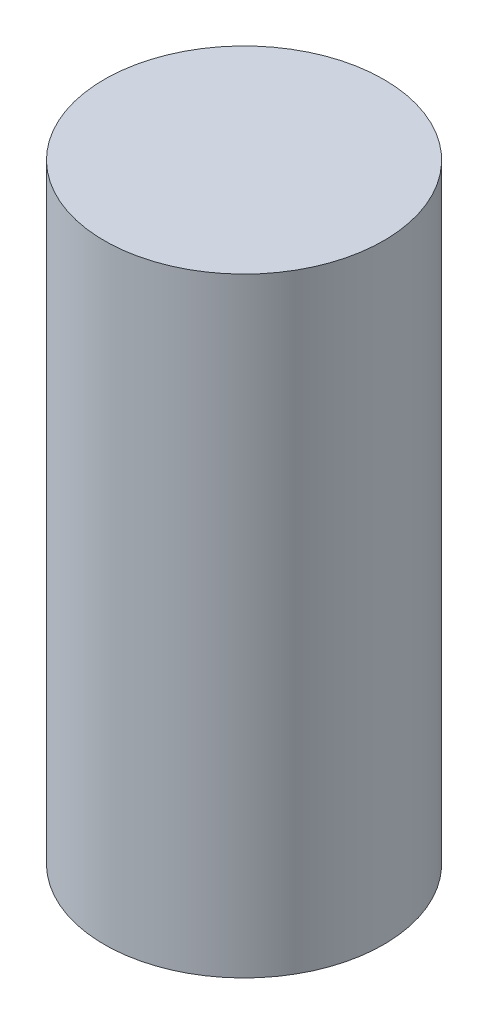
ISO-10303-21;
HEADER;
FILE_DESCRIPTION(('STEP AP214'),'2;1');
FILE_NAME('part.step','',(''),(''),'','','');
FILE_SCHEMA(('AUTOMOTIVE_DESIGN { 1 0 10303 214 1 1 1 1 }'));
ENDSEC;
DATA;
#1=APPLICATION_CONTEXT('core data for automotive mechanical design processes');
#2=APPLICATION_PROTOCOL_DEFINITION('international standard','automotive_design',2000,#1);
#3=PRODUCT_CONTEXT('',#1,'mechanical');
#4=PRODUCT('Part','Part','',(#3));
#5=PRODUCT_RELATED_PRODUCT_CATEGORY('part','',(#4));
#6=PRODUCT_DEFINITION_FORMATION('','',#4);
#7=PRODUCT_DEFINITION_CONTEXT('part definition',#1,'design');
#8=PRODUCT_DEFINITION('design','',#6,#7);
#9=PRODUCT_DEFINITION_SHAPE('','',#8);
#10=(LENGTH_UNIT() NAMED_UNIT(*) SI_UNIT(.MILLI.,.METRE.));
#11=(NAMED_UNIT(*) PLANE_ANGLE_UNIT() SI_UNIT($,.RADIAN.));
#12=(NAMED_UNIT(*) SI_UNIT($,.STERADIAN.) SOLID_ANGLE_UNIT());
#13=UNCERTAINTY_MEASURE_WITH_UNIT(LENGTH_MEASURE(1.E-05),#10,'distance_accuracy_value','');
#14=(GEOMETRIC_REPRESENTATION_CONTEXT(3) GLOBAL_UNCERTAINTY_ASSIGNED_CONTEXT((#13)) GLOBAL_UNIT_ASSIGNED_CONTEXT((#10,
#11,#12)) REPRESENTATION_CONTEXT('',''));
#15=CARTESIAN_POINT('',(0.,0.,0.));
#16=DIRECTION('',(0.,0.,1.));
#17=DIRECTION('',(1.,0.,0.));
#18=AXIS2_PLACEMENT_3D('',#15,#16,#17);
#19=CARTESIAN_POINT('',(0.,6.5,0.));
#20=DIRECTION('',(0.,-1.,0.));
#21=DIRECTION('',(0.,0.,-1.));
#22=AXIS2_PLACEMENT_3D('',#19,#20,#21);
#23=CYLINDRICAL_SURFACE('',#22,1.49);
#24=CARTESIAN_POINT('',(0.,6.5,0.));
#25=DIRECTION('',(0.,1.,0.));
#26=DIRECTION('',(0.,0.,1.));
#27=AXIS2_PLACEMENT_3D('',#24,#25,#26);
#28=CIRCLE('',#27,1.49);
#29=CARTESIAN_POINT('',(0.,6.5,-1.49));
#30=VERTEX_POINT('',#29);
#31=EDGE_CURVE('E10',#30,#30,#28,.T.);
#32=CARTESIAN_POINT('',(0.,0.,0.));
#33=DIRECTION('',(0.,1.,0.));
#34=DIRECTION('',(0.,0.,1.));
#35=AXIS2_PLACEMENT_3D('',#32,#33,#34);
#36=CIRCLE('',#35,1.49);
#37=CARTESIAN_POINT('',(0.,0.,-1.49));
#38=VERTEX_POINT('',#37);
#39=EDGE_CURVE('E44',#38,#38,#36,.T.);
#40=CARTESIAN_POINT('',(0.,6.5,-1.49));
#41=CARTESIAN_POINT('',(0.,6.43229166666667,-1.49));
#42=CARTESIAN_POINT('',(0.,6.36458333333333,-1.49));
#43=CARTESIAN_POINT('',(0.,6.22916666666667,-1.49));
#44=CARTESIAN_POINT('',(0.,6.16145833333333,-1.49));
#45=CARTESIAN_POINT('',(0.,6.02604166666667,-1.49));
#46=CARTESIAN_POINT('',(0.,5.95833333333333,-1.49));
#47=CARTESIAN_POINT('',(0.,5.82291666666667,-1.49));
#48=CARTESIAN_POINT('',(0.,5.75520833333333,-1.49));
#49=CARTESIAN_POINT('',(0.,5.61979166666667,-1.49));
#50=CARTESIAN_POINT('',(0.,5.55208333333333,-1.49));
#51=CARTESIAN_POINT('',(0.,5.41666666666667,-1.49));
#52=CARTESIAN_POINT('',(0.,5.34895833333333,-1.49));
#53=CARTESIAN_POINT('',(0.,5.21354166666667,-1.49));
#54=CARTESIAN_POINT('',(0.,5.14583333333333,-1.49));
#55=CARTESIAN_POINT('',(0.,5.01041666666667,-1.49));
#56=CARTESIAN_POINT('',(0.,4.94270833333333,-1.49));
#57=CARTESIAN_POINT('',(0.,4.80729166666667,-1.49));
#58=CARTESIAN_POINT('',(0.,4.73958333333333,-1.49));
#59=CARTESIAN_POINT('',(0.,4.60416666666667,-1.49));
#60=CARTESIAN_POINT('',(0.,4.53645833333333,-1.49));
#61=CARTESIAN_POINT('',(0.,4.40104166666667,-1.49));
#62=CARTESIAN_POINT('',(0.,4.33333333333333,-1.49));
#63=CARTESIAN_POINT('',(0.,4.19791666666667,-1.49));
#64=CARTESIAN_POINT('',(0.,4.13020833333333,-1.49));
#65=CARTESIAN_POINT('',(0.,3.99479166666667,-1.49));
#66=CARTESIAN_POINT('',(0.,3.92708333333333,-1.49));
#67=CARTESIAN_POINT('',(0.,3.79166666666667,-1.49));
#68=CARTESIAN_POINT('',(0.,3.72395833333333,-1.49));
#69=CARTESIAN_POINT('',(0.,3.58854166666667,-1.49));
#70=CARTESIAN_POINT('',(0.,3.52083333333333,-1.49));
#71=CARTESIAN_POINT('',(0.,3.38541666666667,-1.49));
#72=CARTESIAN_POINT('',(0.,3.31770833333333,-1.49));
#73=CARTESIAN_POINT('',(0.,3.18229166666667,-1.49));
#74=CARTESIAN_POINT('',(0.,3.11458333333333,-1.49));
#75=CARTESIAN_POINT('',(0.,2.97916666666667,-1.49));
#76=CARTESIAN_POINT('',(0.,2.91145833333333,-1.49));
#77=CARTESIAN_POINT('',(0.,2.77604166666667,-1.49));
#78=CARTESIAN_POINT('',(0.,2.70833333333333,-1.49));
#79=CARTESIAN_POINT('',(0.,2.57291666666667,-1.49));
#80=CARTESIAN_POINT('',(0.,2.50520833333333,-1.49));
#81=CARTESIAN_POINT('',(0.,2.36979166666667,-1.49));
#82=CARTESIAN_POINT('',(0.,2.30208333333333,-1.49));
#83=CARTESIAN_POINT('',(0.,2.16666666666667,-1.49));
#84=CARTESIAN_POINT('',(0.,2.09895833333333,-1.49));
#85=CARTESIAN_POINT('',(0.,1.96354166666667,-1.49));
#86=CARTESIAN_POINT('',(0.,1.89583333333333,-1.49));
#87=CARTESIAN_POINT('',(0.,1.76041666666667,-1.49));
#88=CARTESIAN_POINT('',(0.,1.69270833333333,-1.49));
#89=CARTESIAN_POINT('',(0.,1.55729166666667,-1.49));
#90=CARTESIAN_POINT('',(0.,1.48958333333333,-1.49));
#91=CARTESIAN_POINT('',(0.,1.35416666666667,-1.49));
#92=CARTESIAN_POINT('',(0.,1.28645833333333,-1.49));
#93=CARTESIAN_POINT('',(0.,1.15104166666667,-1.49));
#94=CARTESIAN_POINT('',(0.,1.08333333333333,-1.49));
#95=CARTESIAN_POINT('',(0.,0.947916666666667,-1.49));
#96=CARTESIAN_POINT('',(0.,0.880208333333333,-1.49));
#97=CARTESIAN_POINT('',(0.,0.744791666666667,-1.49));
#98=CARTESIAN_POINT('',(0.,0.677083333333333,-1.49));
#99=CARTESIAN_POINT('',(0.,0.541666666666667,-1.49));
#100=CARTESIAN_POINT('',(0.,0.473958333333333,-1.49));
#101=CARTESIAN_POINT('',(0.,0.338541666666667,-1.49));
#102=CARTESIAN_POINT('',(0.,0.270833333333334,-1.49));
#103=CARTESIAN_POINT('',(0.,0.135416666666667,-1.49));
#104=CARTESIAN_POINT('',(0.,0.0677083333333334,-1.49));
#105=CARTESIAN_POINT('',(0.,0.,-1.49));
#106=B_SPLINE_CURVE_WITH_KNOTS('',3,(#40,#41,#42,#43,#44,#45,#46,#47,#48,#49,#50,#51,#52,#53,
#54,#55,#56,#57,#58,#59,#60,#61,#62,#63,#64,#65,#66,#67,#68,#69,#70,#71,#72,#73,#74,#75,#76,#77,
#78,#79,#80,#81,#82,#83,#84,#85,#86,#87,#88,#89,#90,#91,#92,#93,#94,#95,#96,#97,#98,#99,#100,
#101,#102,#103,#104,#105),.UNSPECIFIED.,.F.,.F.,(4,2,2,2,2,2,2,2,2,2,2,2,2,2,2,2,2,2,2,2,2,2,2,
2,2,2,2,2,2,2,2,2,4),(0.,0.203124999999999,0.40625,0.609375,0.812499999999999,1.015625,1.21875,
1.421875,1.625,1.828125,2.03125,2.234375,2.4375,2.640625,2.84375,3.046875,3.25,3.453125,3.65625,
3.859375,4.0625,4.265625,4.46875,4.671875,4.875,5.078125,5.28125,5.484375,5.6875,5.890625,
6.09375,6.296875,6.5),.UNSPECIFIED.);
#107=EDGE_CURVE('BSEAM41',#30,#38,#106,.T.);
#108=ORIENTED_EDGE('',*,*,#31,.F.);
#109=ORIENTED_EDGE('',*,*,#39,.T.);
#110=ORIENTED_EDGE('',*,*,#107,.T.);
#111=ORIENTED_EDGE('',*,*,#107,.F.);
#112=EDGE_LOOP('',(#108,#110,#109,#111));
#113=FACE_BOUND('',#112,.T.);
#114=ADVANCED_FACE('F41',(#113),#23,.T.);
#115=CARTESIAN_POINT('',(0.,6.5,0.));
#116=DIRECTION('',(0.,1.,0.));
#117=DIRECTION('',(0.,0.,1.));
#118=AXIS2_PLACEMENT_3D('',#115,#116,#117);
#119=PLANE('',#118);
#120=ORIENTED_EDGE('',*,*,#31,.T.);
#121=EDGE_LOOP('',(#120));
#122=FACE_BOUND('',#121,.T.);
#123=ADVANCED_FACE('F58',(#122),#119,.T.);
#124=CARTESIAN_POINT('',(0.,0.,0.));
#125=DIRECTION('',(0.,1.,0.));
#126=DIRECTION('',(0.,0.,1.));
#127=AXIS2_PLACEMENT_3D('',#124,#125,#126);
#128=PLANE('',#127);
#129=ORIENTED_EDGE('',*,*,#39,.F.);
#130=EDGE_LOOP('',(#129));
#131=FACE_BOUND('',#130,.T.);
#132=ADVANCED_FACE('F56',(#131),#128,.F.);
#133=CLOSED_SHELL('',(#114,#123,#132));
#134=MANIFOLD_SOLID_BREP('B2',#133);
#135=ADVANCED_BREP_SHAPE_REPRESENTATION('',(#18,#134),#14);
#136=SHAPE_DEFINITION_REPRESENTATION(#9,#135);
ENDSEC;
END-ISO-10303-21;
